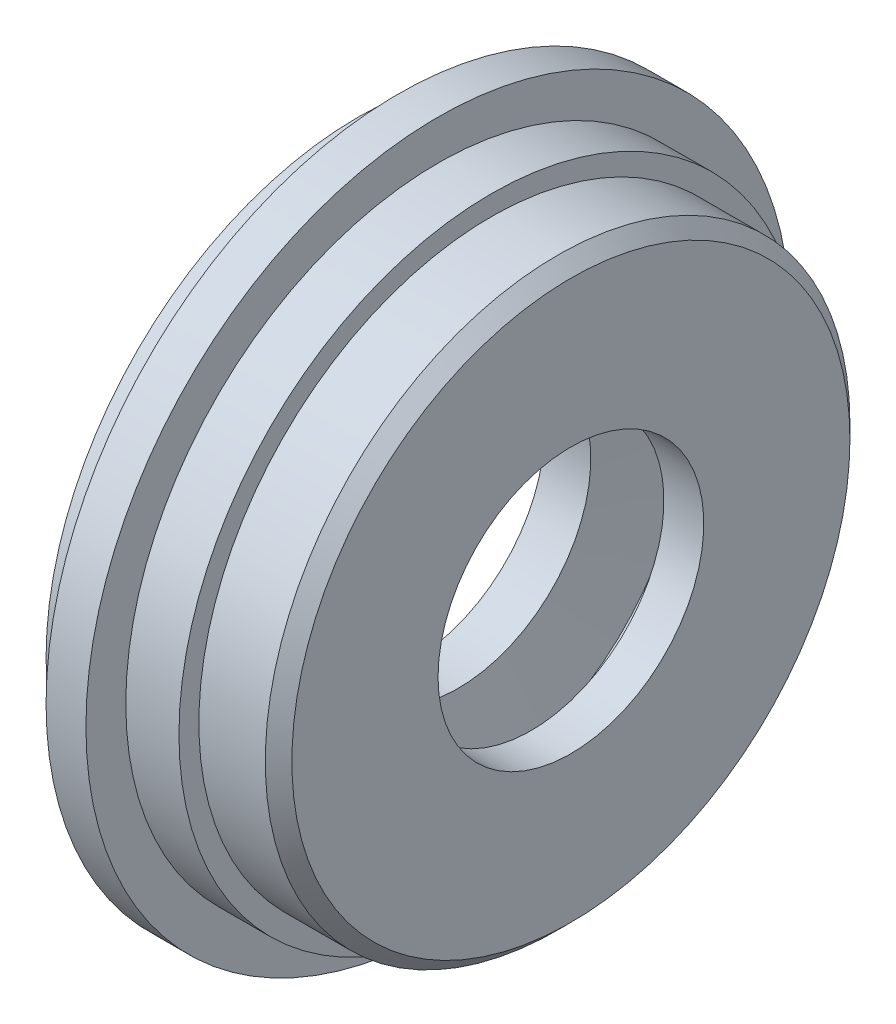
ISO-10303-21;
HEADER;
FILE_DESCRIPTION(('STEP AP214'),'2;1');
FILE_NAME('part.step','',(''),(''),'','','');
FILE_SCHEMA(('AUTOMOTIVE_DESIGN { 1 0 10303 214 1 1 1 1 }'));
ENDSEC;
DATA;
#1=APPLICATION_CONTEXT('core data for automotive mechanical design processes');
#2=APPLICATION_PROTOCOL_DEFINITION('international standard','automotive_design',2000,#1);
#3=PRODUCT_CONTEXT('',#1,'mechanical');
#4=PRODUCT('Part','Part','',(#3));
#5=PRODUCT_RELATED_PRODUCT_CATEGORY('part','',(#4));
#6=PRODUCT_DEFINITION_FORMATION('','',#4);
#7=PRODUCT_DEFINITION_CONTEXT('part definition',#1,'design');
#8=PRODUCT_DEFINITION('design','',#6,#7);
#9=PRODUCT_DEFINITION_SHAPE('','',#8);
#10=(LENGTH_UNIT() NAMED_UNIT(*) SI_UNIT(.MILLI.,.METRE.));
#11=(NAMED_UNIT(*) PLANE_ANGLE_UNIT() SI_UNIT($,.RADIAN.));
#12=(NAMED_UNIT(*) SI_UNIT($,.STERADIAN.) SOLID_ANGLE_UNIT());
#13=UNCERTAINTY_MEASURE_WITH_UNIT(LENGTH_MEASURE(1.E-05),#10,'distance_accuracy_value','');
#14=(GEOMETRIC_REPRESENTATION_CONTEXT(3) GLOBAL_UNCERTAINTY_ASSIGNED_CONTEXT((#13)) GLOBAL_UNIT_ASSIGNED_CONTEXT((#10,
#11,#12)) REPRESENTATION_CONTEXT('',''));
#15=CARTESIAN_POINT('',(0.,0.,0.));
#16=DIRECTION('',(0.,0.,1.));
#17=DIRECTION('',(1.,0.,0.));
#18=AXIS2_PLACEMENT_3D('',#15,#16,#17);
#19=CARTESIAN_POINT('',(16.,0.,0.));
#20=DIRECTION('',(-1.,0.,0.));
#21=DIRECTION('',(0.,0.,1.));
#22=AXIS2_PLACEMENT_3D('',#19,#20,#21);
#23=CYLINDRICAL_SURFACE('',#22,10.);
#24=CARTESIAN_POINT('',(7.5,0.,0.));
#25=DIRECTION('',(-1.,0.,0.));
#26=DIRECTION('',(0.,0.,1.));
#27=AXIS2_PLACEMENT_3D('',#24,#25,#26);
#28=CIRCLE('',#27,10.);
#29=CARTESIAN_POINT('',(7.5,0.,10.));
#30=VERTEX_POINT('',#29);
#31=EDGE_CURVE('E103',#30,#30,#28,.T.);
#32=ORIENTED_EDGE('',*,*,#31,.F.);
#33=EDGE_LOOP('',(#32));
#34=FACE_BOUND('',#33,.T.);
#35=CARTESIAN_POINT('',(4.,0.,0.));
#36=DIRECTION('',(-1.,0.,0.));
#37=DIRECTION('',(0.,0.,1.));
#38=AXIS2_PLACEMENT_3D('',#35,#36,#37);
#39=CIRCLE('',#38,10.);
#40=CARTESIAN_POINT('',(4.,0.,10.));
#41=VERTEX_POINT('',#40);
#42=EDGE_CURVE('E99',#41,#41,#39,.T.);
#43=ORIENTED_EDGE('',*,*,#42,.T.);
#44=EDGE_LOOP('',(#43));
#45=FACE_BOUND('',#44,.T.);
#46=ADVANCED_FACE('F45',(#34,#45),#23,.F.);
#47=CARTESIAN_POINT('',(10.,0.,0.));
#48=DIRECTION('',(-1.,0.,0.));
#49=DIRECTION('',(0.,0.,1.));
#50=AXIS2_PLACEMENT_3D('',#47,#48,#49);
#51=CYLINDRICAL_SURFACE('',#50,23.5);
#52=CARTESIAN_POINT('',(10.,0.,0.));
#53=DIRECTION('',(1.,0.,0.));
#54=DIRECTION('',(0.,0.,-1.));
#55=AXIS2_PLACEMENT_3D('',#52,#53,#54);
#56=CIRCLE('',#55,23.5);
#57=CARTESIAN_POINT('',(10.,0.,-23.5));
#58=VERTEX_POINT('',#57);
#59=EDGE_CURVE('E76',#58,#58,#56,.T.);
#60=ORIENTED_EDGE('',*,*,#59,.F.);
#61=EDGE_LOOP('',(#60));
#62=FACE_BOUND('',#61,.T.);
#63=CARTESIAN_POINT('',(6.,0.,0.));
#64=DIRECTION('',(-1.,0.,0.));
#65=DIRECTION('',(0.,0.,1.));
#66=AXIS2_PLACEMENT_3D('',#63,#64,#65);
#67=CIRCLE('',#66,23.5);
#68=CARTESIAN_POINT('',(6.,0.,23.5));
#69=VERTEX_POINT('',#68);
#70=EDGE_CURVE('E59',#69,#69,#67,.T.);
#71=ORIENTED_EDGE('',*,*,#70,.F.);
#72=EDGE_LOOP('',(#71));
#73=FACE_BOUND('',#72,.T.);
#74=ADVANCED_FACE('F146',(#62,#73),#51,.T.);
#75=CARTESIAN_POINT('',(10.,0.,0.));
#76=DIRECTION('',(1.,0.,0.));
#77=DIRECTION('',(0.,0.,-1.));
#78=AXIS2_PLACEMENT_3D('',#75,#76,#77);
#79=PLANE('',#78);
#80=CARTESIAN_POINT('',(10.,0.,0.));
#81=DIRECTION('',(1.,0.,0.));
#82=DIRECTION('',(0.,0.,-1.));
#83=AXIS2_PLACEMENT_3D('',#80,#81,#82);
#84=CIRCLE('',#83,22.);
#85=CARTESIAN_POINT('',(10.,0.,-22.));
#86=VERTEX_POINT('',#85);
#87=EDGE_CURVE('E64',#86,#86,#84,.T.);
#88=ORIENTED_EDGE('',*,*,#87,.F.);
#89=EDGE_LOOP('',(#88));
#90=FACE_BOUND('',#89,.T.);
#91=ORIENTED_EDGE('',*,*,#59,.T.);
#92=EDGE_LOOP('',(#91));
#93=FACE_BOUND('',#92,.T.);
#94=ADVANCED_FACE('F176',(#90,#93),#79,.T.);
#95=CARTESIAN_POINT('',(16.,0.,0.));
#96=DIRECTION('',(-1.,0.,0.));
#97=DIRECTION('',(0.,0.,1.));
#98=AXIS2_PLACEMENT_3D('',#95,#96,#97);
#99=CYLINDRICAL_SURFACE('',#98,22.);
#100=CARTESIAN_POINT('',(15.,0.,0.));
#101=DIRECTION('',(1.,0.,0.));
#102=DIRECTION('',(0.,0.,-1.));
#103=AXIS2_PLACEMENT_3D('',#100,#101,#102);
#104=CIRCLE('',#103,22.);
#105=CARTESIAN_POINT('',(15.,0.,-22.));
#106=VERTEX_POINT('',#105);
#107=EDGE_CURVE('E10',#106,#106,#104,.F.);
#108=ORIENTED_EDGE('',*,*,#107,.T.);
#109=EDGE_LOOP('',(#108));
#110=FACE_BOUND('',#109,.T.);
#111=ORIENTED_EDGE('',*,*,#87,.T.);
#112=EDGE_LOOP('',(#111));
#113=FACE_BOUND('',#112,.T.);
#114=ADVANCED_FACE('F182',(#110,#113),#99,.T.);
#115=CARTESIAN_POINT('',(16.,0.,0.));
#116=DIRECTION('',(1.,0.,0.));
#117=DIRECTION('',(0.,0.,-1.));
#118=AXIS2_PLACEMENT_3D('',#115,#116,#117);
#119=PLANE('',#118);
#120=CARTESIAN_POINT('',(16.,0.,0.));
#121=DIRECTION('',(1.,0.,0.));
#122=DIRECTION('',(0.,0.,-1.));
#123=AXIS2_PLACEMENT_3D('',#120,#121,#122);
#124=CIRCLE('',#123,21.);
#125=CARTESIAN_POINT('',(16.,0.,-21.));
#126=VERTEX_POINT('',#125);
#127=EDGE_CURVE('E54',#126,#126,#124,.T.);
#128=ORIENTED_EDGE('',*,*,#127,.T.);
#129=EDGE_LOOP('',(#128));
#130=FACE_BOUND('',#129,.T.);
#131=CARTESIAN_POINT('',(16.,0.,0.));
#132=DIRECTION('',(-1.,0.,0.));
#133=DIRECTION('',(0.,0.,1.));
#134=AXIS2_PLACEMENT_3D('',#131,#132,#133);
#135=CIRCLE('',#134,10.);
#136=CARTESIAN_POINT('',(16.,0.,10.));
#137=VERTEX_POINT('',#136);
#138=EDGE_CURVE('E95',#137,#137,#135,.T.);
#139=ORIENTED_EDGE('',*,*,#138,.T.);
#140=EDGE_LOOP('',(#139));
#141=FACE_BOUND('',#140,.T.);
#142=ADVANCED_FACE('F197',(#130,#141),#119,.T.);
#143=CARTESIAN_POINT('',(6.,0.,0.));
#144=DIRECTION('',(-1.,0.,0.));
#145=DIRECTION('',(0.,0.,1.));
#146=AXIS2_PLACEMENT_3D('',#143,#144,#145);
#147=CYLINDRICAL_SURFACE('',#146,26.5);
#148=CARTESIAN_POINT('',(6.,0.,0.));
#149=DIRECTION('',(-1.,0.,0.));
#150=DIRECTION('',(0.,0.,1.));
#151=AXIS2_PLACEMENT_3D('',#148,#149,#150);
#152=CIRCLE('',#151,26.5);
#153=CARTESIAN_POINT('',(6.,0.,26.5));
#154=VERTEX_POINT('',#153);
#155=EDGE_CURVE('E72',#154,#154,#152,.T.);
#156=ORIENTED_EDGE('',*,*,#155,.T.);
#157=EDGE_LOOP('',(#156));
#158=FACE_BOUND('',#157,.T.);
#159=CARTESIAN_POINT('',(3.,0.,0.));
#160=DIRECTION('',(-1.,0.,0.));
#161=DIRECTION('',(0.,0.,1.));
#162=AXIS2_PLACEMENT_3D('',#159,#160,#161);
#163=CIRCLE('',#162,26.5);
#164=CARTESIAN_POINT('',(3.,0.,26.5));
#165=VERTEX_POINT('',#164);
#166=EDGE_CURVE('E83',#165,#165,#163,.T.);
#167=ORIENTED_EDGE('',*,*,#166,.F.);
#168=EDGE_LOOP('',(#167));
#169=FACE_BOUND('',#168,.T.);
#170=ADVANCED_FACE('F192',(#158,#169),#147,.T.);
#171=CARTESIAN_POINT('',(6.,0.,0.));
#172=DIRECTION('',(-1.,0.,0.));
#173=DIRECTION('',(0.,0.,1.));
#174=AXIS2_PLACEMENT_3D('',#171,#172,#173);
#175=PLANE('',#174);
#176=ORIENTED_EDGE('',*,*,#70,.T.);
#177=EDGE_LOOP('',(#176));
#178=FACE_BOUND('',#177,.T.);
#179=ORIENTED_EDGE('',*,*,#155,.F.);
#180=EDGE_LOOP('',(#179));
#181=FACE_BOUND('',#180,.T.);
#182=ADVANCED_FACE('F189',(#178,#181),#175,.F.);
#183=CARTESIAN_POINT('',(3.,0.,0.));
#184=DIRECTION('',(-1.,0.,0.));
#185=DIRECTION('',(0.,0.,1.));
#186=AXIS2_PLACEMENT_3D('',#183,#184,#185);
#187=PLANE('',#186);
#188=CARTESIAN_POINT('',(3.,0.,0.));
#189=DIRECTION('',(-1.,0.,0.));
#190=DIRECTION('',(0.,0.,1.));
#191=AXIS2_PLACEMENT_3D('',#188,#189,#190);
#192=CIRCLE('',#191,23.5);
#193=CARTESIAN_POINT('',(3.,0.,23.5));
#194=VERTEX_POINT('',#193);
#195=EDGE_CURVE('E67',#194,#194,#192,.T.);
#196=ORIENTED_EDGE('',*,*,#195,.F.);
#197=EDGE_LOOP('',(#196));
#198=FACE_BOUND('',#197,.T.);
#199=ORIENTED_EDGE('',*,*,#166,.T.);
#200=EDGE_LOOP('',(#199));
#201=FACE_BOUND('',#200,.T.);
#202=ADVANCED_FACE('F166',(#198,#201),#187,.T.);
#203=CARTESIAN_POINT('',(0.,0.,0.));
#204=DIRECTION('',(1.,0.,0.));
#205=DIRECTION('',(0.,0.,-1.));
#206=AXIS2_PLACEMENT_3D('',#203,#204,#205);
#207=PLANE('',#206);
#208=CARTESIAN_POINT('',(0.,0.,0.));
#209=DIRECTION('',(-1.,0.,0.));
#210=DIRECTION('',(0.,0.,1.));
#211=AXIS2_PLACEMENT_3D('',#208,#209,#210);
#212=CIRCLE('',#211,18.5);
#213=CARTESIAN_POINT('',(0.,0.,18.5));
#214=VERTEX_POINT('',#213);
#215=EDGE_CURVE('E91',#214,#214,#212,.T.);
#216=ORIENTED_EDGE('',*,*,#215,.F.);
#217=EDGE_LOOP('',(#216));
#218=FACE_BOUND('',#217,.T.);
#219=CARTESIAN_POINT('',(0.,0.,0.));
#220=DIRECTION('',(1.,0.,0.));
#221=DIRECTION('',(0.,0.,-1.));
#222=AXIS2_PLACEMENT_3D('',#219,#220,#221);
#223=CIRCLE('',#222,23.5);
#224=CARTESIAN_POINT('',(0.,0.,-23.5));
#225=VERTEX_POINT('',#224);
#226=EDGE_CURVE('E71',#225,#225,#223,.T.);
#227=ORIENTED_EDGE('',*,*,#226,.F.);
#228=EDGE_LOOP('',(#227));
#229=FACE_BOUND('',#228,.T.);
#230=ADVANCED_FACE('F163',(#218,#229),#207,.F.);
#231=ORIENTED_EDGE('',*,*,#195,.T.);
#232=EDGE_LOOP('',(#231));
#233=FACE_BOUND('',#232,.T.);
#234=ORIENTED_EDGE('',*,*,#226,.T.);
#235=EDGE_LOOP('',(#234));
#236=FACE_BOUND('',#235,.T.);
#237=ADVANCED_FACE('F159',(#233,#236),#51,.T.);
#238=CARTESIAN_POINT('',(4.,0.,0.));
#239=DIRECTION('',(-1.,0.,0.));
#240=DIRECTION('',(0.,0.,1.));
#241=AXIS2_PLACEMENT_3D('',#238,#239,#240);
#242=CYLINDRICAL_SURFACE('',#241,18.5);
#243=CARTESIAN_POINT('',(4.,0.,0.));
#244=DIRECTION('',(-1.,0.,0.));
#245=DIRECTION('',(0.,0.,1.));
#246=AXIS2_PLACEMENT_3D('',#243,#244,#245);
#247=CIRCLE('',#246,18.5);
#248=CARTESIAN_POINT('',(4.,0.,18.5));
#249=VERTEX_POINT('',#248);
#250=EDGE_CURVE('E87',#249,#249,#247,.T.);
#251=ORIENTED_EDGE('',*,*,#250,.F.);
#252=EDGE_LOOP('',(#251));
#253=FACE_BOUND('',#252,.T.);
#254=ORIENTED_EDGE('',*,*,#215,.T.);
#255=EDGE_LOOP('',(#254));
#256=FACE_BOUND('',#255,.T.);
#257=ADVANCED_FACE('F153',(#253,#256),#242,.F.);
#258=CARTESIAN_POINT('',(4.,0.,0.));
#259=DIRECTION('',(-1.,0.,0.));
#260=DIRECTION('',(0.,0.,1.));
#261=AXIS2_PLACEMENT_3D('',#258,#259,#260);
#262=PLANE('',#261);
#263=ORIENTED_EDGE('',*,*,#42,.F.);
#264=EDGE_LOOP('',(#263));
#265=FACE_BOUND('',#264,.T.);
#266=ORIENTED_EDGE('',*,*,#250,.T.);
#267=EDGE_LOOP('',(#266));
#268=FACE_BOUND('',#267,.T.);
#269=ADVANCED_FACE('F150',(#265,#268),#262,.T.);
#270=CARTESIAN_POINT('',(13.,0.,0.));
#271=DIRECTION('',(-1.,0.,0.));
#272=DIRECTION('',(0.,0.,1.));
#273=AXIS2_PLACEMENT_3D('',#270,#271,#272);
#274=CIRCLE('',#273,10.);
#275=CARTESIAN_POINT('',(13.,0.,10.));
#276=VERTEX_POINT('',#275);
#277=EDGE_CURVE('E118',#276,#276,#274,.T.);
#278=ORIENTED_EDGE('',*,*,#277,.T.);
#279=EDGE_LOOP('',(#278));
#280=FACE_BOUND('',#279,.T.);
#281=ORIENTED_EDGE('',*,*,#138,.F.);
#282=EDGE_LOOP('',(#281));
#283=FACE_BOUND('',#282,.T.);
#284=ADVANCED_FACE('F123',(#280,#283),#23,.F.);
#285=CARTESIAN_POINT('',(7.5,0.,0.));
#286=DIRECTION('',(1.,0.,0.));
#287=DIRECTION('',(0.,0.,-1.));
#288=AXIS2_PLACEMENT_3D('',#285,#286,#287);
#289=CONICAL_SURFACE('',#288,10.,1.455919721378);
#290=CARTESIAN_POINT('',(8.25,0.,0.));
#291=DIRECTION('',(-1.,0.,0.));
#292=DIRECTION('',(0.,0.,1.));
#293=AXIS2_PLACEMENT_3D('',#290,#291,#292);
#294=CIRCLE('',#293,16.5);
#295=CARTESIAN_POINT('',(8.25,0.,16.5));
#296=VERTEX_POINT('',#295);
#297=EDGE_CURVE('E110',#296,#296,#294,.T.);
#298=ORIENTED_EDGE('',*,*,#297,.F.);
#299=EDGE_LOOP('',(#298));
#300=FACE_BOUND('',#299,.T.);
#301=ORIENTED_EDGE('',*,*,#31,.T.);
#302=EDGE_LOOP('',(#301));
#303=FACE_BOUND('',#302,.T.);
#304=ADVANCED_FACE('F135',(#300,#303),#289,.F.);
#305=CARTESIAN_POINT('',(0.,0.,0.));
#306=DIRECTION('',(-1.,0.,0.));
#307=DIRECTION('',(0.,0.,1.));
#308=AXIS2_PLACEMENT_3D('',#305,#306,#307);
#309=CYLINDRICAL_SURFACE('',#308,16.5);
#310=CARTESIAN_POINT('',(12.25,0.,0.));
#311=DIRECTION('',(-1.,0.,0.));
#312=DIRECTION('',(0.,0.,1.));
#313=AXIS2_PLACEMENT_3D('',#310,#311,#312);
#314=CIRCLE('',#313,16.5);
#315=CARTESIAN_POINT('',(12.25,0.,16.5));
#316=VERTEX_POINT('',#315);
#317=EDGE_CURVE('E114',#316,#316,#314,.T.);
#318=ORIENTED_EDGE('',*,*,#317,.F.);
#319=EDGE_LOOP('',(#318));
#320=FACE_BOUND('',#319,.T.);
#321=ORIENTED_EDGE('',*,*,#297,.T.);
#322=EDGE_LOOP('',(#321));
#323=FACE_BOUND('',#322,.T.);
#324=ADVANCED_FACE('F129',(#320,#323),#309,.F.);
#325=CARTESIAN_POINT('',(12.25,0.,0.));
#326=DIRECTION('',(-1.,0.,0.));
#327=DIRECTION('',(0.,0.,1.));
#328=AXIS2_PLACEMENT_3D('',#325,#326,#327);
#329=CONICAL_SURFACE('',#328,16.5,1.455919721378);
#330=ORIENTED_EDGE('',*,*,#277,.F.);
#331=EDGE_LOOP('',(#330));
#332=FACE_BOUND('',#331,.T.);
#333=ORIENTED_EDGE('',*,*,#317,.T.);
#334=EDGE_LOOP('',(#333));
#335=FACE_BOUND('',#334,.T.);
#336=ADVANCED_FACE('F126',(#332,#335),#329,.F.);
#337=CARTESIAN_POINT('',(16.,0.,0.));
#338=DIRECTION('',(-1.,0.,0.));
#339=DIRECTION('',(0.,0.,1.));
#340=AXIS2_PLACEMENT_3D('',#337,#338,#339);
#341=CONICAL_SURFACE('',#340,21.,0.785398163397448);
#342=ORIENTED_EDGE('',*,*,#107,.F.);
#343=EDGE_LOOP('',(#342));
#344=FACE_BOUND('',#343,.T.);
#345=ORIENTED_EDGE('',*,*,#127,.F.);
#346=EDGE_LOOP('',(#345));
#347=FACE_BOUND('',#346,.T.);
#348=ADVANCED_FACE('F48',(#344,#347),#341,.T.);
#349=CLOSED_SHELL('',(#46,#74,#94,#114,#142,#170,#182,#202,#230,#237,#257,#269,#284,#304,#324,
#336,#348));
#350=MANIFOLD_SOLID_BREP('B2',#349);
#351=ADVANCED_BREP_SHAPE_REPRESENTATION('',(#18,#350),#14);
#352=SHAPE_DEFINITION_REPRESENTATION(#9,#351);
ENDSEC;
END-ISO-10303-21;
